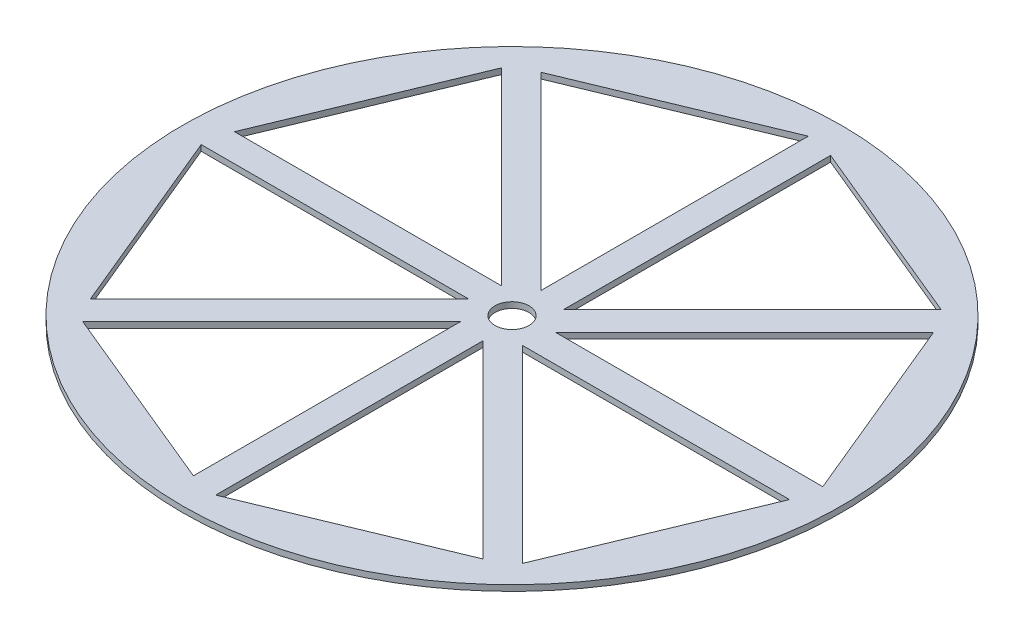
ISO-10303-21;
HEADER;
FILE_DESCRIPTION(('STEP AP214'),'2;1');
FILE_NAME('part.step','',(''),(''),'','','');
FILE_SCHEMA(('AUTOMOTIVE_DESIGN { 1 0 10303 214 1 1 1 1 }'));
ENDSEC;
DATA;
#1=APPLICATION_CONTEXT('core data for automotive mechanical design processes');
#2=APPLICATION_PROTOCOL_DEFINITION('international standard','automotive_design',2000,#1);
#3=PRODUCT_CONTEXT('',#1,'mechanical');
#4=PRODUCT('Part','Part','',(#3));
#5=PRODUCT_RELATED_PRODUCT_CATEGORY('part','',(#4));
#6=PRODUCT_DEFINITION_FORMATION('','',#4);
#7=PRODUCT_DEFINITION_CONTEXT('part definition',#1,'design');
#8=PRODUCT_DEFINITION('design','',#6,#7);
#9=PRODUCT_DEFINITION_SHAPE('','',#8);
#10=(LENGTH_UNIT() NAMED_UNIT(*) SI_UNIT(.MILLI.,.METRE.));
#11=(NAMED_UNIT(*) PLANE_ANGLE_UNIT() SI_UNIT($,.RADIAN.));
#12=(NAMED_UNIT(*) SI_UNIT($,.STERADIAN.) SOLID_ANGLE_UNIT());
#13=UNCERTAINTY_MEASURE_WITH_UNIT(LENGTH_MEASURE(1.E-05),#10,'distance_accuracy_value','');
#14=(GEOMETRIC_REPRESENTATION_CONTEXT(3) GLOBAL_UNCERTAINTY_ASSIGNED_CONTEXT((#13)) GLOBAL_UNIT_ASSIGNED_CONTEXT((#10,
#11,#12)) REPRESENTATION_CONTEXT('',''));
#15=CARTESIAN_POINT('',(0.,0.,0.));
#16=DIRECTION('',(0.,0.,1.));
#17=DIRECTION('',(1.,0.,0.));
#18=AXIS2_PLACEMENT_3D('',#15,#16,#17);
#19=CARTESIAN_POINT('',(0.,2.85,0.));
#20=DIRECTION('',(0.,1.,0.));
#21=DIRECTION('',(0.,0.,1.));
#22=AXIS2_PLACEMENT_3D('',#19,#20,#21);
#23=PLANE('',#22);
#24=DIRECTION('',(-1.,0.,0.));
#25=VECTOR('',#24,1.);
#26=CARTESIAN_POINT('',(0.,2.85,9.99999999999998));
#27=LINE('',#26,#25);
#28=CARTESIAN_POINT('',(145.,2.85,10.000000000001));
#29=VERTEX_POINT('',#28);
#30=CARTESIAN_POINT('',(14.9999999999999,2.85,10.0000000000001));
#31=VERTEX_POINT('',#30);
#32=EDGE_CURVE('E127',#29,#31,#27,.T.);
#33=ORIENTED_EDGE('',*,*,#32,.F.);
#34=DIRECTION('',(0.382683432365094,0.,-0.923879532511285));
#35=VECTOR('',#34,1.);
#36=CARTESIAN_POINT('',(127.300775541957,2.85,52.7297077300925));
#37=LINE('',#36,#35);
#38=CARTESIAN_POINT('',(106.923881554251,2.85,101.923881554251));
#39=VERTEX_POINT('',#38);
#40=EDGE_CURVE('E385',#39,#29,#37,.T.);
#41=ORIENTED_EDGE('',*,*,#40,.F.);
#42=DIRECTION('',(0.707106781186547,0.,0.707106781186548));
#43=VECTOR('',#42,1.);
#44=CARTESIAN_POINT('',(2.49999999999994,2.85,-2.49999999999993));
#45=LINE('',#44,#43);
#46=EDGE_CURVE('E388',#31,#39,#45,.T.);
#47=ORIENTED_EDGE('',*,*,#46,.F.);
#48=EDGE_LOOP('',(#33,#41,#47));
#49=FACE_BOUND('',#48,.T.);
#50=DIRECTION('',(-0.707106781186551,0.,0.707106781186544));
#51=VECTOR('',#50,1.);
#52=CARTESIAN_POINT('',(7.07106781186542,2.85,7.0710678118655));
#53=LINE('',#52,#51);
#54=CARTESIAN_POINT('',(109.601551083915,2.85,-95.4594154601834));
#55=VERTEX_POINT('',#54);
#56=CARTESIAN_POINT('',(17.6776695296637,2.85,-3.53553390593265));
#57=VERTEX_POINT('',#56);
#58=EDGE_CURVE('E131',#55,#57,#53,.T.);
#59=ORIENTED_EDGE('',*,*,#58,.F.);
#60=DIRECTION('',(-0.382683432365088,0.,-0.923879532511288));
#61=VECTOR('',#60,1.);
#62=CARTESIAN_POINT('',(127.300775541958,2.85,-52.7297077300917));
#63=LINE('',#62,#61);
#64=CARTESIAN_POINT('',(147.677669529664,2.85,-3.53553390593271));
#65=VERTEX_POINT('',#64);
#66=EDGE_CURVE('E358',#65,#55,#63,.T.);
#67=ORIENTED_EDGE('',*,*,#66,.F.);
#68=DIRECTION('',(1.,0.,0.));
#69=VECTOR('',#68,1.);
#70=CARTESIAN_POINT('',(0.,2.85,-3.53553390593264));
#71=LINE('',#70,#69);
#72=EDGE_CURVE('E368',#57,#65,#71,.T.);
#73=ORIENTED_EDGE('',*,*,#72,.F.);
#74=EDGE_LOOP('',(#59,#67,#73));
#75=FACE_BOUND('',#74,.T.);
#76=DIRECTION('',(0.,0.,1.));
#77=VECTOR('',#76,1.);
#78=CARTESIAN_POINT('',(9.99999999999998,2.85,0.));
#79=LINE('',#78,#77);
#80=CARTESIAN_POINT('',(10.0000000000005,2.85,-145.));
#81=VERTEX_POINT('',#80);
#82=CARTESIAN_POINT('',(10.,2.85,-15.));
#83=VERTEX_POINT('',#82);
#84=EDGE_CURVE('E372',#81,#83,#79,.T.);
#85=ORIENTED_EDGE('',*,*,#84,.F.);
#86=DIRECTION('',(-0.923879532511286,0.,-0.382683432365091));
#87=VECTOR('',#86,1.);
#88=CARTESIAN_POINT('',(52.7297077300921,2.85,-127.300775541958));
#89=LINE('',#88,#87);
#90=CARTESIAN_POINT('',(101.923881554251,2.85,-106.923881554251));
#91=VERTEX_POINT('',#90);
#92=EDGE_CURVE('E427',#91,#81,#89,.T.);
#93=ORIENTED_EDGE('',*,*,#92,.F.);
#94=DIRECTION('',(0.707106781186546,0.,-0.707106781186549));
#95=VECTOR('',#94,1.);
#96=CARTESIAN_POINT('',(-2.49999999999994,2.85,-2.49999999999993));
#97=LINE('',#96,#95);
#98=EDGE_CURVE('E440',#83,#91,#97,.T.);
#99=ORIENTED_EDGE('',*,*,#98,.F.);
#100=EDGE_LOOP('',(#85,#93,#99));
#101=FACE_BOUND('',#100,.T.);
#102=DIRECTION('',(0.707106781186546,0.,0.707106781186549));
#103=VECTOR('',#102,1.);
#104=CARTESIAN_POINT('',(7.07106781186548,2.85,-7.07106781186546));
#105=LINE('',#104,#103);
#106=CARTESIAN_POINT('',(-95.4594154601838,2.85,-109.601551083915));
#107=VERTEX_POINT('',#106);
#108=CARTESIAN_POINT('',(-3.53553390593272,2.85,-17.6776695296637));
#109=VERTEX_POINT('',#108);
#110=EDGE_CURVE('E408',#107,#109,#105,.T.);
#111=ORIENTED_EDGE('',*,*,#110,.F.);
#112=DIRECTION('',(-0.923879532511286,0.,0.382683432365091));
#113=VECTOR('',#112,1.);
#114=CARTESIAN_POINT('',(-52.7297077300921,2.85,-127.300775541958));
#115=LINE('',#114,#113);
#116=CARTESIAN_POINT('',(-3.53553390593322,2.85,-147.677669529664));
#117=VERTEX_POINT('',#116);
#118=EDGE_CURVE('E401',#117,#107,#115,.T.);
#119=ORIENTED_EDGE('',*,*,#118,.F.);
#120=DIRECTION('',(0.,0.,-1.));
#121=VECTOR('',#120,1.);
#122=CARTESIAN_POINT('',(-3.53553390593265,2.85,0.));
#123=LINE('',#122,#121);
#124=EDGE_CURVE('E415',#109,#117,#123,.T.);
#125=ORIENTED_EDGE('',*,*,#124,.F.);
#126=EDGE_LOOP('',(#111,#119,#125));
#127=FACE_BOUND('',#126,.T.);
#128=DIRECTION('',(0.707106781186556,0.,-0.707106781186539));
#129=VECTOR('',#128,1.);
#130=CARTESIAN_POINT('',(-7.07106781186538,2.85,-7.07106781186555));
#131=LINE('',#130,#129);
#132=CARTESIAN_POINT('',(-109.601551083916,2.85,95.4594154601826));
#133=VERTEX_POINT('',#132);
#134=CARTESIAN_POINT('',(-17.6776695296637,2.85,3.53553390593253));
#135=VERTEX_POINT('',#134);
#136=EDGE_CURVE('E276',#133,#135,#131,.T.);
#137=ORIENTED_EDGE('',*,*,#136,.F.);
#138=DIRECTION('',(0.382683432365081,0.,0.92387953251129));
#139=VECTOR('',#138,1.);
#140=CARTESIAN_POINT('',(-127.300775541958,2.85,52.7297077300908));
#141=LINE('',#140,#139);
#142=CARTESIAN_POINT('',(-147.677669529664,2.85,3.5355339059317));
#143=VERTEX_POINT('',#142);
#144=EDGE_CURVE('E294',#143,#133,#141,.T.);
#145=ORIENTED_EDGE('',*,*,#144,.F.);
#146=DIRECTION('',(-1.,0.,0.));
#147=VECTOR('',#146,1.);
#148=CARTESIAN_POINT('',(0.,2.85,3.53553390593265));
#149=LINE('',#148,#147);
#150=EDGE_CURVE('E300',#135,#143,#149,.T.);
#151=ORIENTED_EDGE('',*,*,#150,.F.);
#152=EDGE_LOOP('',(#137,#145,#151));
#153=FACE_BOUND('',#152,.T.);
#154=DIRECTION('',(0.,0.,-1.));
#155=VECTOR('',#154,1.);
#156=CARTESIAN_POINT('',(-9.99999999999999,2.85,-1.0461716962814E-13));
#157=LINE('',#156,#155);
#158=CARTESIAN_POINT('',(-10.0000000000015,2.85,145.));
#159=VERTEX_POINT('',#158);
#160=CARTESIAN_POINT('',(-10.0000000000001,2.85,14.9999999999999));
#161=VERTEX_POINT('',#160);
#162=EDGE_CURVE('E304',#159,#161,#157,.T.);
#163=ORIENTED_EDGE('',*,*,#162,.F.);
#164=DIRECTION('',(0.923879532511284,0.,0.382683432365097));
#165=VECTOR('',#164,1.);
#166=CARTESIAN_POINT('',(-52.729707730093,2.85,127.300775541957));
#167=LINE('',#166,#165);
#168=CARTESIAN_POINT('',(-101.923881554252,2.85,106.923881554251));
#169=VERTEX_POINT('',#168);
#170=EDGE_CURVE('E337',#169,#159,#167,.T.);
#171=ORIENTED_EDGE('',*,*,#170,.F.);
#172=DIRECTION('',(-0.707106781186551,0.,0.707106781186544));
#173=VECTOR('',#172,1.);
#174=CARTESIAN_POINT('',(2.49999999999992,2.85,2.49999999999995));
#175=LINE('',#174,#173);
#176=EDGE_CURVE('E342',#161,#169,#175,.T.);
#177=ORIENTED_EDGE('',*,*,#176,.F.);
#178=EDGE_LOOP('',(#163,#171,#177));
#179=FACE_BOUND('',#178,.T.);
#180=DIRECTION('',(-0.707106781186541,0.,-0.707106781186554));
#181=VECTOR('',#180,1.);
#182=CARTESIAN_POINT('',(-7.07106781186552,2.85,7.0710678118654));
#183=LINE('',#182,#181);
#184=CARTESIAN_POINT('',(95.459415460183,2.85,109.601551083916));
#185=VERTEX_POINT('',#184);
#186=CARTESIAN_POINT('',(3.5355339059326,2.85,17.6776695296637));
#187=VERTEX_POINT('',#186);
#188=EDGE_CURVE('E318',#185,#187,#183,.T.);
#189=ORIENTED_EDGE('',*,*,#188,.F.);
#190=DIRECTION('',(0.923879532511289,0.,-0.382683432365084));
#191=VECTOR('',#190,1.);
#192=CARTESIAN_POINT('',(52.7297077300913,2.85,127.300775541958));
#193=LINE('',#192,#191);
#194=CARTESIAN_POINT('',(3.53553390593221,2.85,147.677669529664));
#195=VERTEX_POINT('',#194);
#196=EDGE_CURVE('E313',#195,#185,#193,.T.);
#197=ORIENTED_EDGE('',*,*,#196,.F.);
#198=DIRECTION('',(0.,0.,1.));
#199=VECTOR('',#198,1.);
#200=CARTESIAN_POINT('',(3.53553390593265,2.85,0.));
#201=LINE('',#200,#199);
#202=EDGE_CURVE('E319',#187,#195,#201,.T.);
#203=ORIENTED_EDGE('',*,*,#202,.F.);
#204=EDGE_LOOP('',(#189,#197,#203));
#205=FACE_BOUND('',#204,.T.);
#206=DIRECTION('',(-0.707106781186551,0.,-0.707106781186544));
#207=VECTOR('',#206,1.);
#208=CARTESIAN_POINT('',(-2.49999999999992,2.85,2.49999999999995));
#209=LINE('',#208,#207);
#210=CARTESIAN_POINT('',(-15.,2.85,-9.99999999999998));
#211=VERTEX_POINT('',#210);
#212=CARTESIAN_POINT('',(-106.923881554252,2.85,-101.923881554251));
#213=VERTEX_POINT('',#212);
#214=EDGE_CURVE('E419',#211,#213,#209,.T.);
#215=ORIENTED_EDGE('',*,*,#214,.F.);
#216=DIRECTION('',(1.,0.,0.));
#217=VECTOR('',#216,1.);
#218=CARTESIAN_POINT('',(0.,2.85,-9.99999999999998));
#219=LINE('',#218,#217);
#220=CARTESIAN_POINT('',(-145.,2.85,-9.99999999999998));
#221=VERTEX_POINT('',#220);
#222=EDGE_CURVE('E451',#221,#211,#219,.T.);
#223=ORIENTED_EDGE('',*,*,#222,.F.);
#224=DIRECTION('',(-0.382683432365087,0.,0.923879532511288));
#225=VECTOR('',#224,1.);
#226=CARTESIAN_POINT('',(-127.300775541958,2.85,-52.7297077300917));
#227=LINE('',#226,#225);
#228=EDGE_CURVE('E459',#213,#221,#227,.T.);
#229=ORIENTED_EDGE('',*,*,#228,.F.);
#230=EDGE_LOOP('',(#215,#223,#229));
#231=FACE_BOUND('',#230,.T.);
#232=CARTESIAN_POINT('',(0.,2.85,0.));
#233=DIRECTION('',(0.,1.,0.));
#234=DIRECTION('',(0.,0.,1.));
#235=AXIS2_PLACEMENT_3D('',#232,#233,#234);
#236=CIRCLE('',#235,160.3375);
#237=CARTESIAN_POINT('',(0.,2.85,160.3375));
#238=VERTEX_POINT('',#237);
#239=EDGE_CURVE('E12',#238,#238,#236,.T.);
#240=ORIENTED_EDGE('',*,*,#239,.T.);
#241=EDGE_LOOP('',(#240));
#242=FACE_BOUND('',#241,.T.);
#243=CARTESIAN_POINT('',(0.,2.85,0.));
#244=DIRECTION('',(0.,1.,0.));
#245=DIRECTION('',(0.,0.,1.));
#246=AXIS2_PLACEMENT_3D('',#243,#244,#245);
#247=CIRCLE('',#246,8.3);
#248=CARTESIAN_POINT('',(0.,2.85,8.3));
#249=VERTEX_POINT('',#248);
#250=EDGE_CURVE('E473',#249,#249,#247,.T.);
#251=ORIENTED_EDGE('',*,*,#250,.F.);
#252=EDGE_LOOP('',(#251));
#253=FACE_BOUND('',#252,.T.);
#254=ADVANCED_FACE('F112',(#49,#75,#101,#127,#153,#179,#205,#231,#242,#253),#23,.T.);
#255=CARTESIAN_POINT('',(0.,0.,0.));
#256=DIRECTION('',(0.,1.,0.));
#257=DIRECTION('',(0.,0.,1.));
#258=AXIS2_PLACEMENT_3D('',#255,#256,#257);
#259=PLANE('',#258);
#260=DIRECTION('',(0.382683432365094,0.,-0.923879532511285));
#261=VECTOR('',#260,1.);
#262=CARTESIAN_POINT('',(127.300775541957,0.,52.7297077300925));
#263=LINE('',#262,#261);
#264=CARTESIAN_POINT('',(106.923881554251,0.,101.923881554251));
#265=VERTEX_POINT('',#264);
#266=CARTESIAN_POINT('',(145.,0.,10.000000000001));
#267=VERTEX_POINT('',#266);
#268=EDGE_CURVE('E384',#265,#267,#263,.T.);
#269=ORIENTED_EDGE('',*,*,#268,.T.);
#270=DIRECTION('',(-1.,0.,0.));
#271=VECTOR('',#270,1.);
#272=CARTESIAN_POINT('',(0.,0.,9.99999999999998));
#273=LINE('',#272,#271);
#274=CARTESIAN_POINT('',(14.9999999999999,0.,10.0000000000001));
#275=VERTEX_POINT('',#274);
#276=EDGE_CURVE('E378',#267,#275,#273,.T.);
#277=ORIENTED_EDGE('',*,*,#276,.T.);
#278=DIRECTION('',(0.707106781186547,0.,0.707106781186548));
#279=VECTOR('',#278,1.);
#280=CARTESIAN_POINT('',(2.49999999999994,0.,-2.49999999999993));
#281=LINE('',#280,#279);
#282=EDGE_CURVE('E381',#275,#265,#281,.T.);
#283=ORIENTED_EDGE('',*,*,#282,.T.);
#284=EDGE_LOOP('',(#269,#277,#283));
#285=FACE_BOUND('',#284,.T.);
#286=DIRECTION('',(-0.382683432365088,0.,-0.923879532511288));
#287=VECTOR('',#286,1.);
#288=CARTESIAN_POINT('',(127.300775541958,0.,-52.7297077300917));
#289=LINE('',#288,#287);
#290=CARTESIAN_POINT('',(147.677669529664,0.,-3.53553390593271));
#291=VERTEX_POINT('',#290);
#292=CARTESIAN_POINT('',(109.601551083915,0.,-95.4594154601834));
#293=VERTEX_POINT('',#292);
#294=EDGE_CURVE('E363',#291,#293,#289,.T.);
#295=ORIENTED_EDGE('',*,*,#294,.T.);
#296=DIRECTION('',(-0.707106781186551,0.,0.707106781186544));
#297=VECTOR('',#296,1.);
#298=CARTESIAN_POINT('',(7.07106781186542,0.,7.0710678118655));
#299=LINE('',#298,#297);
#300=CARTESIAN_POINT('',(17.6776695296637,0.,-3.53553390593265));
#301=VERTEX_POINT('',#300);
#302=EDGE_CURVE('E351',#293,#301,#299,.T.);
#303=ORIENTED_EDGE('',*,*,#302,.T.);
#304=DIRECTION('',(1.,0.,0.));
#305=VECTOR('',#304,1.);
#306=CARTESIAN_POINT('',(0.,0.,-3.53553390593264));
#307=LINE('',#306,#305);
#308=EDGE_CURVE('E360',#301,#291,#307,.T.);
#309=ORIENTED_EDGE('',*,*,#308,.T.);
#310=EDGE_LOOP('',(#295,#303,#309));
#311=FACE_BOUND('',#310,.T.);
#312=DIRECTION('',(-0.923879532511286,0.,-0.382683432365091));
#313=VECTOR('',#312,1.);
#314=CARTESIAN_POINT('',(52.7297077300921,0.,-127.300775541958));
#315=LINE('',#314,#313);
#316=CARTESIAN_POINT('',(101.923881554251,0.,-106.923881554251));
#317=VERTEX_POINT('',#316);
#318=CARTESIAN_POINT('',(10.0000000000005,0.,-145.));
#319=VERTEX_POINT('',#318);
#320=EDGE_CURVE('E435',#317,#319,#315,.T.);
#321=ORIENTED_EDGE('',*,*,#320,.T.);
#322=DIRECTION('',(0.,0.,1.));
#323=VECTOR('',#322,1.);
#324=CARTESIAN_POINT('',(9.99999999999998,0.,0.));
#325=LINE('',#324,#323);
#326=CARTESIAN_POINT('',(10.,0.,-15.));
#327=VERTEX_POINT('',#326);
#328=EDGE_CURVE('E422',#319,#327,#325,.T.);
#329=ORIENTED_EDGE('',*,*,#328,.T.);
#330=DIRECTION('',(0.707106781186546,0.,-0.707106781186549));
#331=VECTOR('',#330,1.);
#332=CARTESIAN_POINT('',(-2.49999999999994,0.,-2.49999999999993));
#333=LINE('',#332,#331);
#334=EDGE_CURVE('E428',#327,#317,#333,.T.);
#335=ORIENTED_EDGE('',*,*,#334,.T.);
#336=EDGE_LOOP('',(#321,#329,#335));
#337=FACE_BOUND('',#336,.T.);
#338=DIRECTION('',(-0.923879532511286,0.,0.382683432365091));
#339=VECTOR('',#338,1.);
#340=CARTESIAN_POINT('',(-52.7297077300921,0.,-127.300775541958));
#341=LINE('',#340,#339);
#342=CARTESIAN_POINT('',(-3.53553390593322,0.,-147.677669529664));
#343=VERTEX_POINT('',#342);
#344=CARTESIAN_POINT('',(-95.4594154601838,0.,-109.601551083915));
#345=VERTEX_POINT('',#344);
#346=EDGE_CURVE('E407',#343,#345,#341,.T.);
#347=ORIENTED_EDGE('',*,*,#346,.T.);
#348=DIRECTION('',(0.707106781186546,0.,0.707106781186549));
#349=VECTOR('',#348,1.);
#350=CARTESIAN_POINT('',(7.07106781186548,0.,-7.07106781186546));
#351=LINE('',#350,#349);
#352=CARTESIAN_POINT('',(-3.53553390593272,0.,-17.6776695296637));
#353=VERTEX_POINT('',#352);
#354=EDGE_CURVE('E397',#345,#353,#351,.T.);
#355=ORIENTED_EDGE('',*,*,#354,.T.);
#356=DIRECTION('',(0.,0.,-1.));
#357=VECTOR('',#356,1.);
#358=CARTESIAN_POINT('',(-3.53553390593265,0.,0.));
#359=LINE('',#358,#357);
#360=EDGE_CURVE('E405',#353,#343,#359,.T.);
#361=ORIENTED_EDGE('',*,*,#360,.T.);
#362=EDGE_LOOP('',(#347,#355,#361));
#363=FACE_BOUND('',#362,.T.);
#364=DIRECTION('',(0.382683432365081,0.,0.92387953251129));
#365=VECTOR('',#364,1.);
#366=CARTESIAN_POINT('',(-127.300775541958,0.,52.7297077300908));
#367=LINE('',#366,#365);
#368=CARTESIAN_POINT('',(-147.677669529664,0.,3.5355339059317));
#369=VERTEX_POINT('',#368);
#370=CARTESIAN_POINT('',(-109.601551083916,0.,95.4594154601826));
#371=VERTEX_POINT('',#370);
#372=EDGE_CURVE('E281',#369,#371,#367,.T.);
#373=ORIENTED_EDGE('',*,*,#372,.T.);
#374=DIRECTION('',(0.707106781186556,0.,-0.707106781186539));
#375=VECTOR('',#374,1.);
#376=CARTESIAN_POINT('',(-7.07106781186538,0.,-7.07106781186555));
#377=LINE('',#376,#375);
#378=CARTESIAN_POINT('',(-17.6776695296637,0.,3.53553390593253));
#379=VERTEX_POINT('',#378);
#380=EDGE_CURVE('E277',#371,#379,#377,.T.);
#381=ORIENTED_EDGE('',*,*,#380,.T.);
#382=DIRECTION('',(-1.,0.,0.));
#383=VECTOR('',#382,1.);
#384=CARTESIAN_POINT('',(0.,0.,3.53553390593265));
#385=LINE('',#384,#383);
#386=EDGE_CURVE('E288',#379,#369,#385,.T.);
#387=ORIENTED_EDGE('',*,*,#386,.T.);
#388=EDGE_LOOP('',(#373,#381,#387));
#389=FACE_BOUND('',#388,.T.);
#390=DIRECTION('',(0.923879532511284,0.,0.382683432365097));
#391=VECTOR('',#390,1.);
#392=CARTESIAN_POINT('',(-52.729707730093,0.,127.300775541957));
#393=LINE('',#392,#391);
#394=CARTESIAN_POINT('',(-101.923881554252,0.,106.923881554251));
#395=VERTEX_POINT('',#394);
#396=CARTESIAN_POINT('',(-10.0000000000015,0.,145.));
#397=VERTEX_POINT('',#396);
#398=EDGE_CURVE('E336',#395,#397,#393,.T.);
#399=ORIENTED_EDGE('',*,*,#398,.T.);
#400=DIRECTION('',(0.,0.,-1.));
#401=VECTOR('',#400,1.);
#402=CARTESIAN_POINT('',(-9.99999999999999,0.,-1.0461716962814E-13));
#403=LINE('',#402,#401);
#404=CARTESIAN_POINT('',(-10.0000000000001,0.,14.9999999999999));
#405=VERTEX_POINT('',#404);
#406=EDGE_CURVE('E335',#397,#405,#403,.T.);
#407=ORIENTED_EDGE('',*,*,#406,.T.);
#408=DIRECTION('',(-0.707106781186551,0.,0.707106781186544));
#409=VECTOR('',#408,1.);
#410=CARTESIAN_POINT('',(2.49999999999992,0.,2.49999999999995));
#411=LINE('',#410,#409);
#412=EDGE_CURVE('E333',#405,#395,#411,.T.);
#413=ORIENTED_EDGE('',*,*,#412,.T.);
#414=EDGE_LOOP('',(#399,#407,#413));
#415=FACE_BOUND('',#414,.T.);
#416=DIRECTION('',(0.923879532511289,0.,-0.382683432365084));
#417=VECTOR('',#416,1.);
#418=CARTESIAN_POINT('',(52.7297077300913,0.,127.300775541958));
#419=LINE('',#418,#417);
#420=CARTESIAN_POINT('',(3.53553390593221,0.,147.677669529664));
#421=VERTEX_POINT('',#420);
#422=CARTESIAN_POINT('',(95.459415460183,0.,109.601551083916));
#423=VERTEX_POINT('',#422);
#424=EDGE_CURVE('E314',#421,#423,#419,.T.);
#425=ORIENTED_EDGE('',*,*,#424,.T.);
#426=DIRECTION('',(-0.707106781186541,0.,-0.707106781186554));
#427=VECTOR('',#426,1.);
#428=CARTESIAN_POINT('',(-7.07106781186552,0.,7.0710678118654));
#429=LINE('',#428,#427);
#430=CARTESIAN_POINT('',(3.5355339059326,0.,17.6776695296637));
#431=VERTEX_POINT('',#430);
#432=EDGE_CURVE('E307',#423,#431,#429,.T.);
#433=ORIENTED_EDGE('',*,*,#432,.T.);
#434=DIRECTION('',(0.,0.,1.));
#435=VECTOR('',#434,1.);
#436=CARTESIAN_POINT('',(3.53553390593265,0.,0.));
#437=LINE('',#436,#435);
#438=EDGE_CURVE('E309',#431,#421,#437,.T.);
#439=ORIENTED_EDGE('',*,*,#438,.T.);
#440=EDGE_LOOP('',(#425,#433,#439));
#441=FACE_BOUND('',#440,.T.);
#442=DIRECTION('',(1.,0.,0.));
#443=VECTOR('',#442,1.);
#444=CARTESIAN_POINT('',(0.,0.,-9.99999999999998));
#445=LINE('',#444,#443);
#446=CARTESIAN_POINT('',(-145.,0.,-9.99999999999999));
#447=VERTEX_POINT('',#446);
#448=CARTESIAN_POINT('',(-15.,0.,-9.99999999999998));
#449=VERTEX_POINT('',#448);
#450=EDGE_CURVE('E452',#447,#449,#445,.T.);
#451=ORIENTED_EDGE('',*,*,#450,.T.);
#452=DIRECTION('',(-0.707106781186551,0.,-0.707106781186544));
#453=VECTOR('',#452,1.);
#454=CARTESIAN_POINT('',(-2.49999999999992,0.,2.49999999999995));
#455=LINE('',#454,#453);
#456=CARTESIAN_POINT('',(-106.923881554252,0.,-101.923881554251));
#457=VERTEX_POINT('',#456);
#458=EDGE_CURVE('E450',#449,#457,#455,.T.);
#459=ORIENTED_EDGE('',*,*,#458,.T.);
#460=DIRECTION('',(-0.382683432365087,0.,0.923879532511288));
#461=VECTOR('',#460,1.);
#462=CARTESIAN_POINT('',(-127.300775541958,0.,-52.7297077300917));
#463=LINE('',#462,#461);
#464=EDGE_CURVE('E448',#457,#447,#463,.T.);
#465=ORIENTED_EDGE('',*,*,#464,.T.);
#466=EDGE_LOOP('',(#451,#459,#465));
#467=FACE_BOUND('',#466,.T.);
#468=CARTESIAN_POINT('',(0.,0.,0.));
#469=DIRECTION('',(0.,1.,0.));
#470=DIRECTION('',(0.,0.,1.));
#471=AXIS2_PLACEMENT_3D('',#468,#469,#470);
#472=CIRCLE('',#471,160.3375);
#473=CARTESIAN_POINT('',(0.,0.,160.3375));
#474=VERTEX_POINT('',#473);
#475=EDGE_CURVE('E113',#474,#474,#472,.T.);
#476=ORIENTED_EDGE('',*,*,#475,.F.);
#477=EDGE_LOOP('',(#476));
#478=FACE_BOUND('',#477,.T.);
#479=CARTESIAN_POINT('',(0.,0.,0.));
#480=DIRECTION('',(0.,1.,0.));
#481=DIRECTION('',(0.,0.,1.));
#482=AXIS2_PLACEMENT_3D('',#479,#480,#481);
#483=CIRCLE('',#482,8.3);
#484=CARTESIAN_POINT('',(0.,0.,8.3));
#485=VERTEX_POINT('',#484);
#486=EDGE_CURVE('E466',#485,#485,#483,.T.);
#487=ORIENTED_EDGE('',*,*,#486,.T.);
#488=EDGE_LOOP('',(#487));
#489=FACE_BOUND('',#488,.T.);
#490=ADVANCED_FACE('F295',(#285,#311,#337,#363,#389,#415,#441,#467,#478,#489),#259,.F.);
#491=CARTESIAN_POINT('',(0.,2.85,0.));
#492=DIRECTION('',(0.,-1.,0.));
#493=DIRECTION('',(0.,0.,-1.));
#494=AXIS2_PLACEMENT_3D('',#491,#492,#493);
#495=CYLINDRICAL_SURFACE('',#494,160.3375);
#496=ORIENTED_EDGE('',*,*,#239,.F.);
#497=EDGE_LOOP('',(#496));
#498=FACE_BOUND('',#497,.T.);
#499=ORIENTED_EDGE('',*,*,#475,.T.);
#500=EDGE_LOOP('',(#499));
#501=FACE_BOUND('',#500,.T.);
#502=ADVANCED_FACE('F114',(#498,#501),#495,.T.);
#503=CARTESIAN_POINT('',(0.,2.85,0.));
#504=DIRECTION('',(0.,-1.,0.));
#505=DIRECTION('',(0.,0.,-1.));
#506=AXIS2_PLACEMENT_3D('',#503,#504,#505);
#507=CYLINDRICAL_SURFACE('',#506,8.3);
#508=ORIENTED_EDGE('',*,*,#250,.T.);
#509=EDGE_LOOP('',(#508));
#510=FACE_BOUND('',#509,.T.);
#511=ORIENTED_EDGE('',*,*,#486,.F.);
#512=EDGE_LOOP('',(#511));
#513=FACE_BOUND('',#512,.T.);
#514=ADVANCED_FACE('F476',(#510,#513),#507,.F.);
#515=CARTESIAN_POINT('',(-2.49999999999992,0.,2.49999999999995));
#516=DIRECTION('',(0.707106781186544,0.,-0.707106781186551));
#517=DIRECTION('',(-0.707106781186551,0.,-0.707106781186544));
#518=AXIS2_PLACEMENT_3D('',#515,#516,#517);
#519=PLANE('',#518);
#520=ORIENTED_EDGE('',*,*,#214,.T.);
#521=DIRECTION('',(0.,1.,0.));
#522=VECTOR('',#521,1.);
#523=CARTESIAN_POINT('',(-106.923881554252,0.,-101.923881554251));
#524=LINE('',#523,#522);
#525=EDGE_CURVE('E460',#457,#213,#524,.T.);
#526=ORIENTED_EDGE('',*,*,#525,.F.);
#527=ORIENTED_EDGE('',*,*,#458,.F.);
#528=DIRECTION('',(0.,1.,0.));
#529=VECTOR('',#528,1.);
#530=CARTESIAN_POINT('',(-15.,0.,-9.99999999999998));
#531=LINE('',#530,#529);
#532=EDGE_CURVE('E461',#449,#211,#531,.T.);
#533=ORIENTED_EDGE('',*,*,#532,.T.);
#534=EDGE_LOOP('',(#520,#526,#527,#533));
#535=FACE_BOUND('',#534,.T.);
#536=ADVANCED_FACE('F477',(#535),#519,.F.);
#537=CARTESIAN_POINT('',(0.,0.,-9.99999999999998));
#538=DIRECTION('',(0.,0.,1.));
#539=DIRECTION('',(1.,0.,0.));
#540=AXIS2_PLACEMENT_3D('',#537,#538,#539);
#541=PLANE('',#540);
#542=ORIENTED_EDGE('',*,*,#222,.T.);
#543=ORIENTED_EDGE('',*,*,#532,.F.);
#544=ORIENTED_EDGE('',*,*,#450,.F.);
#545=DIRECTION('',(0.,1.,0.));
#546=VECTOR('',#545,1.);
#547=CARTESIAN_POINT('',(-145.,0.,-9.99999999999998));
#548=LINE('',#547,#546);
#549=EDGE_CURVE('E470',#447,#221,#548,.T.);
#550=ORIENTED_EDGE('',*,*,#549,.T.);
#551=EDGE_LOOP('',(#542,#543,#544,#550));
#552=FACE_BOUND('',#551,.T.);
#553=ADVANCED_FACE('F488',(#552),#541,.F.);
#554=CARTESIAN_POINT('',(-127.300775541958,0.,-52.7297077300917));
#555=DIRECTION('',(-0.923879532511288,0.,-0.382683432365087));
#556=DIRECTION('',(-0.382683432365087,0.,0.923879532511288));
#557=AXIS2_PLACEMENT_3D('',#554,#555,#556);
#558=PLANE('',#557);
#559=ORIENTED_EDGE('',*,*,#228,.T.);
#560=ORIENTED_EDGE('',*,*,#549,.F.);
#561=ORIENTED_EDGE('',*,*,#464,.F.);
#562=ORIENTED_EDGE('',*,*,#525,.T.);
#563=EDGE_LOOP('',(#559,#560,#561,#562));
#564=FACE_BOUND('',#563,.T.);
#565=ADVANCED_FACE('F536',(#564),#558,.F.);
#566=CARTESIAN_POINT('',(-7.07106781186552,0.,7.0710678118654));
#567=DIRECTION('',(0.707106781186554,0.,-0.707106781186541));
#568=DIRECTION('',(-0.707106781186541,0.,-0.707106781186554));
#569=AXIS2_PLACEMENT_3D('',#566,#567,#568);
#570=PLANE('',#569);
#571=ORIENTED_EDGE('',*,*,#188,.T.);
#572=DIRECTION('',(0.,1.,0.));
#573=VECTOR('',#572,1.);
#574=CARTESIAN_POINT('',(3.5355339059326,0.,17.6776695296637));
#575=LINE('',#574,#573);
#576=EDGE_CURVE('E320',#431,#187,#575,.T.);
#577=ORIENTED_EDGE('',*,*,#576,.F.);
#578=ORIENTED_EDGE('',*,*,#432,.F.);
#579=DIRECTION('',(0.,1.,0.));
#580=VECTOR('',#579,1.);
#581=CARTESIAN_POINT('',(95.459415460183,0.,109.601551083916));
#582=LINE('',#581,#580);
#583=EDGE_CURVE('E326',#423,#185,#582,.T.);
#584=ORIENTED_EDGE('',*,*,#583,.T.);
#585=EDGE_LOOP('',(#571,#577,#578,#584));
#586=FACE_BOUND('',#585,.T.);
#587=ADVANCED_FACE('F544',(#586),#570,.F.);
#588=CARTESIAN_POINT('',(52.7297077300913,0.,127.300775541958));
#589=DIRECTION('',(0.382683432365084,0.,0.923879532511289));
#590=DIRECTION('',(0.923879532511289,0.,-0.382683432365084));
#591=AXIS2_PLACEMENT_3D('',#588,#589,#590);
#592=PLANE('',#591);
#593=ORIENTED_EDGE('',*,*,#196,.T.);
#594=ORIENTED_EDGE('',*,*,#583,.F.);
#595=ORIENTED_EDGE('',*,*,#424,.F.);
#596=DIRECTION('',(0.,1.,0.));
#597=VECTOR('',#596,1.);
#598=CARTESIAN_POINT('',(3.53553390593221,0.,147.677669529664));
#599=LINE('',#598,#597);
#600=EDGE_CURVE('E327',#421,#195,#599,.T.);
#601=ORIENTED_EDGE('',*,*,#600,.T.);
#602=EDGE_LOOP('',(#593,#594,#595,#601));
#603=FACE_BOUND('',#602,.T.);
#604=ADVANCED_FACE('F606',(#603),#592,.F.);
#605=CARTESIAN_POINT('',(3.53553390593265,0.,0.));
#606=DIRECTION('',(-1.,0.,0.));
#607=DIRECTION('',(0.,0.,1.));
#608=AXIS2_PLACEMENT_3D('',#605,#606,#607);
#609=PLANE('',#608);
#610=ORIENTED_EDGE('',*,*,#202,.T.);
#611=ORIENTED_EDGE('',*,*,#600,.F.);
#612=ORIENTED_EDGE('',*,*,#438,.F.);
#613=ORIENTED_EDGE('',*,*,#576,.T.);
#614=EDGE_LOOP('',(#610,#611,#612,#613));
#615=FACE_BOUND('',#614,.T.);
#616=ADVANCED_FACE('F598',(#615),#609,.F.);
#617=CARTESIAN_POINT('',(-9.99999999999999,0.,-1.0461716962814E-13));
#618=DIRECTION('',(1.,0.,0.));
#619=DIRECTION('',(0.,0.,-1.));
#620=AXIS2_PLACEMENT_3D('',#617,#618,#619);
#621=PLANE('',#620);
#622=ORIENTED_EDGE('',*,*,#162,.T.);
#623=DIRECTION('',(0.,1.,0.));
#624=VECTOR('',#623,1.);
#625=CARTESIAN_POINT('',(-10.0000000000001,0.,14.9999999999999));
#626=LINE('',#625,#624);
#627=EDGE_CURVE('E345',#405,#161,#626,.T.);
#628=ORIENTED_EDGE('',*,*,#627,.F.);
#629=ORIENTED_EDGE('',*,*,#406,.F.);
#630=DIRECTION('',(0.,1.,0.));
#631=VECTOR('',#630,1.);
#632=CARTESIAN_POINT('',(-10.0000000000015,0.,145.));
#633=LINE('',#632,#631);
#634=EDGE_CURVE('E321',#397,#159,#633,.T.);
#635=ORIENTED_EDGE('',*,*,#634,.T.);
#636=EDGE_LOOP('',(#622,#628,#629,#635));
#637=FACE_BOUND('',#636,.T.);
#638=ADVANCED_FACE('F592',(#637),#621,.F.);
#639=CARTESIAN_POINT('',(-52.729707730093,0.,127.300775541957));
#640=DIRECTION('',(-0.382683432365097,0.,0.923879532511284));
#641=DIRECTION('',(0.923879532511284,0.,0.382683432365097));
#642=AXIS2_PLACEMENT_3D('',#639,#640,#641);
#643=PLANE('',#642);
#644=ORIENTED_EDGE('',*,*,#170,.T.);
#645=ORIENTED_EDGE('',*,*,#634,.F.);
#646=ORIENTED_EDGE('',*,*,#398,.F.);
#647=DIRECTION('',(0.,1.,0.));
#648=VECTOR('',#647,1.);
#649=CARTESIAN_POINT('',(-101.923881554252,0.,106.923881554251));
#650=LINE('',#649,#648);
#651=EDGE_CURVE('E348',#395,#169,#650,.T.);
#652=ORIENTED_EDGE('',*,*,#651,.T.);
#653=EDGE_LOOP('',(#644,#645,#646,#652));
#654=FACE_BOUND('',#653,.T.);
#655=ADVANCED_FACE('F600',(#654),#643,.F.);
#656=CARTESIAN_POINT('',(2.49999999999992,0.,2.49999999999995));
#657=DIRECTION('',(-0.707106781186544,0.,-0.707106781186551));
#658=DIRECTION('',(-0.707106781186551,0.,0.707106781186544));
#659=AXIS2_PLACEMENT_3D('',#656,#657,#658);
#660=PLANE('',#659);
#661=ORIENTED_EDGE('',*,*,#176,.T.);
#662=ORIENTED_EDGE('',*,*,#651,.F.);
#663=ORIENTED_EDGE('',*,*,#412,.F.);
#664=ORIENTED_EDGE('',*,*,#627,.T.);
#665=EDGE_LOOP('',(#661,#662,#663,#664));
#666=FACE_BOUND('',#665,.T.);
#667=ADVANCED_FACE('F599',(#666),#660,.F.);
#668=CARTESIAN_POINT('',(-7.07106781186538,0.,-7.07106781186555));
#669=DIRECTION('',(0.707106781186539,0.,0.707106781186556));
#670=DIRECTION('',(0.707106781186556,0.,-0.707106781186539));
#671=AXIS2_PLACEMENT_3D('',#668,#669,#670);
#672=PLANE('',#671);
#673=ORIENTED_EDGE('',*,*,#136,.T.);
#674=DIRECTION('',(0.,1.,0.));
#675=VECTOR('',#674,1.);
#676=CARTESIAN_POINT('',(-17.6776695296637,0.,3.53553390593253));
#677=LINE('',#676,#675);
#678=EDGE_CURVE('E275',#379,#135,#677,.T.);
#679=ORIENTED_EDGE('',*,*,#678,.F.);
#680=ORIENTED_EDGE('',*,*,#380,.F.);
#681=DIRECTION('',(0.,1.,0.));
#682=VECTOR('',#681,1.);
#683=CARTESIAN_POINT('',(-109.601551083916,0.,95.4594154601826));
#684=LINE('',#683,#682);
#685=EDGE_CURVE('E303',#371,#133,#684,.T.);
#686=ORIENTED_EDGE('',*,*,#685,.T.);
#687=EDGE_LOOP('',(#673,#679,#680,#686));
#688=FACE_BOUND('',#687,.T.);
#689=ADVANCED_FACE('F273',(#688),#672,.F.);
#690=CARTESIAN_POINT('',(-127.300775541958,0.,52.7297077300908));
#691=DIRECTION('',(-0.92387953251129,0.,0.382683432365081));
#692=DIRECTION('',(0.382683432365081,0.,0.92387953251129));
#693=AXIS2_PLACEMENT_3D('',#690,#691,#692);
#694=PLANE('',#693);
#695=ORIENTED_EDGE('',*,*,#144,.T.);
#696=ORIENTED_EDGE('',*,*,#685,.F.);
#697=ORIENTED_EDGE('',*,*,#372,.F.);
#698=DIRECTION('',(0.,1.,0.));
#699=VECTOR('',#698,1.);
#700=CARTESIAN_POINT('',(-147.677669529664,0.,3.5355339059317));
#701=LINE('',#700,#699);
#702=EDGE_CURVE('E284',#369,#143,#701,.T.);
#703=ORIENTED_EDGE('',*,*,#702,.T.);
#704=EDGE_LOOP('',(#695,#696,#697,#703));
#705=FACE_BOUND('',#704,.T.);
#706=ADVANCED_FACE('F617',(#705),#694,.F.);
#707=CARTESIAN_POINT('',(0.,0.,3.53553390593265));
#708=DIRECTION('',(0.,0.,-1.));
#709=DIRECTION('',(-1.,0.,0.));
#710=AXIS2_PLACEMENT_3D('',#707,#708,#709);
#711=PLANE('',#710);
#712=ORIENTED_EDGE('',*,*,#150,.T.);
#713=ORIENTED_EDGE('',*,*,#702,.F.);
#714=ORIENTED_EDGE('',*,*,#386,.F.);
#715=ORIENTED_EDGE('',*,*,#678,.T.);
#716=EDGE_LOOP('',(#712,#713,#714,#715));
#717=FACE_BOUND('',#716,.T.);
#718=ADVANCED_FACE('F287',(#717),#711,.F.);
#719=CARTESIAN_POINT('',(7.07106781186548,0.,-7.07106781186546));
#720=DIRECTION('',(-0.707106781186548,0.,0.707106781186546));
#721=DIRECTION('',(0.707106781186546,0.,0.707106781186549));
#722=AXIS2_PLACEMENT_3D('',#719,#720,#721);
#723=PLANE('',#722);
#724=ORIENTED_EDGE('',*,*,#110,.T.);
#725=DIRECTION('',(0.,1.,0.));
#726=VECTOR('',#725,1.);
#727=CARTESIAN_POINT('',(-3.53553390593272,0.,-17.6776695296637));
#728=LINE('',#727,#726);
#729=EDGE_CURVE('E406',#353,#109,#728,.T.);
#730=ORIENTED_EDGE('',*,*,#729,.F.);
#731=ORIENTED_EDGE('',*,*,#354,.F.);
#732=DIRECTION('',(0.,1.,0.));
#733=VECTOR('',#732,1.);
#734=CARTESIAN_POINT('',(-95.4594154601838,0.,-109.601551083915));
#735=LINE('',#734,#733);
#736=EDGE_CURVE('E416',#345,#107,#735,.T.);
#737=ORIENTED_EDGE('',*,*,#736,.T.);
#738=EDGE_LOOP('',(#724,#730,#731,#737));
#739=FACE_BOUND('',#738,.T.);
#740=ADVANCED_FACE('F565',(#739),#723,.F.);
#741=CARTESIAN_POINT('',(-52.7297077300921,0.,-127.300775541958));
#742=DIRECTION('',(-0.382683432365091,0.,-0.923879532511286));
#743=DIRECTION('',(-0.923879532511287,0.,0.382683432365091));
#744=AXIS2_PLACEMENT_3D('',#741,#742,#743);
#745=PLANE('',#744);
#746=ORIENTED_EDGE('',*,*,#118,.T.);
#747=ORIENTED_EDGE('',*,*,#736,.F.);
#748=ORIENTED_EDGE('',*,*,#346,.F.);
#749=DIRECTION('',(0.,1.,0.));
#750=VECTOR('',#749,1.);
#751=CARTESIAN_POINT('',(-3.53553390593322,0.,-147.677669529664));
#752=LINE('',#751,#750);
#753=EDGE_CURVE('E423',#343,#117,#752,.T.);
#754=ORIENTED_EDGE('',*,*,#753,.T.);
#755=EDGE_LOOP('',(#746,#747,#748,#754));
#756=FACE_BOUND('',#755,.T.);
#757=ADVANCED_FACE('F564',(#756),#745,.F.);
#758=CARTESIAN_POINT('',(-3.53553390593265,0.,0.));
#759=DIRECTION('',(1.,0.,0.));
#760=DIRECTION('',(0.,0.,-1.));
#761=AXIS2_PLACEMENT_3D('',#758,#759,#760);
#762=PLANE('',#761);
#763=ORIENTED_EDGE('',*,*,#124,.T.);
#764=ORIENTED_EDGE('',*,*,#753,.F.);
#765=ORIENTED_EDGE('',*,*,#360,.F.);
#766=ORIENTED_EDGE('',*,*,#729,.T.);
#767=EDGE_LOOP('',(#763,#764,#765,#766));
#768=FACE_BOUND('',#767,.T.);
#769=ADVANCED_FACE('F555',(#768),#762,.F.);
#770=CARTESIAN_POINT('',(9.99999999999998,0.,0.));
#771=DIRECTION('',(-1.,0.,0.));
#772=DIRECTION('',(0.,0.,1.));
#773=AXIS2_PLACEMENT_3D('',#770,#771,#772);
#774=PLANE('',#773);
#775=ORIENTED_EDGE('',*,*,#84,.T.);
#776=DIRECTION('',(0.,1.,0.));
#777=VECTOR('',#776,1.);
#778=CARTESIAN_POINT('',(10.,0.,-15.));
#779=LINE('',#778,#777);
#780=EDGE_CURVE('E434',#327,#83,#779,.T.);
#781=ORIENTED_EDGE('',*,*,#780,.F.);
#782=ORIENTED_EDGE('',*,*,#328,.F.);
#783=DIRECTION('',(0.,1.,0.));
#784=VECTOR('',#783,1.);
#785=CARTESIAN_POINT('',(10.0000000000005,0.,-145.));
#786=LINE('',#785,#784);
#787=EDGE_CURVE('E413',#319,#81,#786,.T.);
#788=ORIENTED_EDGE('',*,*,#787,.T.);
#789=EDGE_LOOP('',(#775,#781,#782,#788));
#790=FACE_BOUND('',#789,.T.);
#791=ADVANCED_FACE('F547',(#790),#774,.F.);
#792=CARTESIAN_POINT('',(52.7297077300921,0.,-127.300775541958));
#793=DIRECTION('',(0.382683432365091,0.,-0.923879532511286));
#794=DIRECTION('',(-0.923879532511287,0.,-0.382683432365091));
#795=AXIS2_PLACEMENT_3D('',#792,#793,#794);
#796=PLANE('',#795);
#797=ORIENTED_EDGE('',*,*,#92,.T.);
#798=ORIENTED_EDGE('',*,*,#787,.F.);
#799=ORIENTED_EDGE('',*,*,#320,.F.);
#800=DIRECTION('',(0.,1.,0.));
#801=VECTOR('',#800,1.);
#802=CARTESIAN_POINT('',(101.923881554251,0.,-106.923881554251));
#803=LINE('',#802,#801);
#804=EDGE_CURVE('E444',#317,#91,#803,.T.);
#805=ORIENTED_EDGE('',*,*,#804,.T.);
#806=EDGE_LOOP('',(#797,#798,#799,#805));
#807=FACE_BOUND('',#806,.T.);
#808=ADVANCED_FACE('F552',(#807),#796,.F.);
#809=CARTESIAN_POINT('',(-2.49999999999994,0.,-2.49999999999993));
#810=DIRECTION('',(0.707106781186549,0.,0.707106781186546));
#811=DIRECTION('',(0.707106781186546,0.,-0.707106781186549));
#812=AXIS2_PLACEMENT_3D('',#809,#810,#811);
#813=PLANE('',#812);
#814=ORIENTED_EDGE('',*,*,#98,.T.);
#815=ORIENTED_EDGE('',*,*,#804,.F.);
#816=ORIENTED_EDGE('',*,*,#334,.F.);
#817=ORIENTED_EDGE('',*,*,#780,.T.);
#818=EDGE_LOOP('',(#814,#815,#816,#817));
#819=FACE_BOUND('',#818,.T.);
#820=ADVANCED_FACE('F551',(#819),#813,.F.);
#821=CARTESIAN_POINT('',(7.07106781186542,0.,7.0710678118655));
#822=DIRECTION('',(-0.707106781186544,0.,-0.707106781186551));
#823=DIRECTION('',(-0.707106781186551,0.,0.707106781186544));
#824=AXIS2_PLACEMENT_3D('',#821,#822,#823);
#825=PLANE('',#824);
#826=ORIENTED_EDGE('',*,*,#58,.T.);
#827=DIRECTION('',(0.,1.,0.));
#828=VECTOR('',#827,1.);
#829=CARTESIAN_POINT('',(17.6776695296637,0.,-3.53553390593265));
#830=LINE('',#829,#828);
#831=EDGE_CURVE('E365',#301,#57,#830,.T.);
#832=ORIENTED_EDGE('',*,*,#831,.F.);
#833=ORIENTED_EDGE('',*,*,#302,.F.);
#834=DIRECTION('',(0.,1.,0.));
#835=VECTOR('',#834,1.);
#836=CARTESIAN_POINT('',(109.601551083915,0.,-95.4594154601834));
#837=LINE('',#836,#835);
#838=EDGE_CURVE('E375',#293,#55,#837,.T.);
#839=ORIENTED_EDGE('',*,*,#838,.T.);
#840=EDGE_LOOP('',(#826,#832,#833,#839));
#841=FACE_BOUND('',#840,.T.);
#842=ADVANCED_FACE('F560',(#841),#825,.F.);
#843=CARTESIAN_POINT('',(127.300775541958,0.,-52.7297077300917));
#844=DIRECTION('',(0.923879532511288,0.,-0.382683432365088));
#845=DIRECTION('',(-0.382683432365088,0.,-0.923879532511288));
#846=AXIS2_PLACEMENT_3D('',#843,#844,#845);
#847=PLANE('',#846);
#848=ORIENTED_EDGE('',*,*,#66,.T.);
#849=ORIENTED_EDGE('',*,*,#838,.F.);
#850=ORIENTED_EDGE('',*,*,#294,.F.);
#851=DIRECTION('',(0.,1.,0.));
#852=VECTOR('',#851,1.);
#853=CARTESIAN_POINT('',(147.677669529664,0.,-3.53553390593271));
#854=LINE('',#853,#852);
#855=EDGE_CURVE('E374',#291,#65,#854,.T.);
#856=ORIENTED_EDGE('',*,*,#855,.T.);
#857=EDGE_LOOP('',(#848,#849,#850,#856));
#858=FACE_BOUND('',#857,.T.);
#859=ADVANCED_FACE('F590',(#858),#847,.F.);
#860=CARTESIAN_POINT('',(0.,0.,-3.53553390593264));
#861=DIRECTION('',(0.,0.,1.));
#862=DIRECTION('',(1.,0.,0.));
#863=AXIS2_PLACEMENT_3D('',#860,#861,#862);
#864=PLANE('',#863);
#865=ORIENTED_EDGE('',*,*,#72,.T.);
#866=ORIENTED_EDGE('',*,*,#855,.F.);
#867=ORIENTED_EDGE('',*,*,#308,.F.);
#868=ORIENTED_EDGE('',*,*,#831,.T.);
#869=EDGE_LOOP('',(#865,#866,#867,#868));
#870=FACE_BOUND('',#869,.T.);
#871=ADVANCED_FACE('F580',(#870),#864,.F.);
#872=CARTESIAN_POINT('',(0.,0.,9.99999999999998));
#873=DIRECTION('',(0.,0.,-1.));
#874=DIRECTION('',(-1.,0.,0.));
#875=AXIS2_PLACEMENT_3D('',#872,#873,#874);
#876=PLANE('',#875);
#877=ORIENTED_EDGE('',*,*,#32,.T.);
#878=DIRECTION('',(0.,1.,0.));
#879=VECTOR('',#878,1.);
#880=CARTESIAN_POINT('',(14.9999999999999,0.,10.0000000000001));
#881=LINE('',#880,#879);
#882=EDGE_CURVE('E389',#275,#31,#881,.T.);
#883=ORIENTED_EDGE('',*,*,#882,.F.);
#884=ORIENTED_EDGE('',*,*,#276,.F.);
#885=DIRECTION('',(0.,1.,0.));
#886=VECTOR('',#885,1.);
#887=CARTESIAN_POINT('',(145.,0.,10.000000000001));
#888=LINE('',#887,#886);
#889=EDGE_CURVE('E370',#267,#29,#888,.T.);
#890=ORIENTED_EDGE('',*,*,#889,.T.);
#891=EDGE_LOOP('',(#877,#883,#884,#890));
#892=FACE_BOUND('',#891,.T.);
#893=ADVANCED_FACE('F574',(#892),#876,.F.);
#894=CARTESIAN_POINT('',(127.300775541957,0.,52.7297077300925));
#895=DIRECTION('',(0.923879532511285,0.,0.382683432365094));
#896=DIRECTION('',(0.382683432365094,0.,-0.923879532511285));
#897=AXIS2_PLACEMENT_3D('',#894,#895,#896);
#898=PLANE('',#897);
#899=ORIENTED_EDGE('',*,*,#40,.T.);
#900=ORIENTED_EDGE('',*,*,#889,.F.);
#901=ORIENTED_EDGE('',*,*,#268,.F.);
#902=DIRECTION('',(0.,1.,0.));
#903=VECTOR('',#902,1.);
#904=CARTESIAN_POINT('',(106.923881554251,0.,101.923881554251));
#905=LINE('',#904,#903);
#906=EDGE_CURVE('E396',#265,#39,#905,.T.);
#907=ORIENTED_EDGE('',*,*,#906,.T.);
#908=EDGE_LOOP('',(#899,#900,#901,#907));
#909=FACE_BOUND('',#908,.T.);
#910=ADVANCED_FACE('F576',(#909),#898,.F.);
#911=CARTESIAN_POINT('',(2.49999999999994,0.,-2.49999999999993));
#912=DIRECTION('',(-0.707106781186548,0.,0.707106781186546));
#913=DIRECTION('',(0.707106781186547,0.,0.707106781186548));
#914=AXIS2_PLACEMENT_3D('',#911,#912,#913);
#915=PLANE('',#914);
#916=ORIENTED_EDGE('',*,*,#46,.T.);
#917=ORIENTED_EDGE('',*,*,#906,.F.);
#918=ORIENTED_EDGE('',*,*,#282,.F.);
#919=ORIENTED_EDGE('',*,*,#882,.T.);
#920=EDGE_LOOP('',(#916,#917,#918,#919));
#921=FACE_BOUND('',#920,.T.);
#922=ADVANCED_FACE('F578',(#921),#915,.F.);
#923=CLOSED_SHELL('',(#254,#490,#502,#514,#536,#553,#565,#587,#604,#616,#638,#655,#667,#689,
#706,#718,#740,#757,#769,#791,#808,#820,#842,#859,#871,#893,#910,#922));
#924=MANIFOLD_SOLID_BREP('B2',#923);
#925=ADVANCED_BREP_SHAPE_REPRESENTATION('',(#18,#924),#14);
#926=SHAPE_DEFINITION_REPRESENTATION(#9,#925);
ENDSEC;
END-ISO-10303-21;
